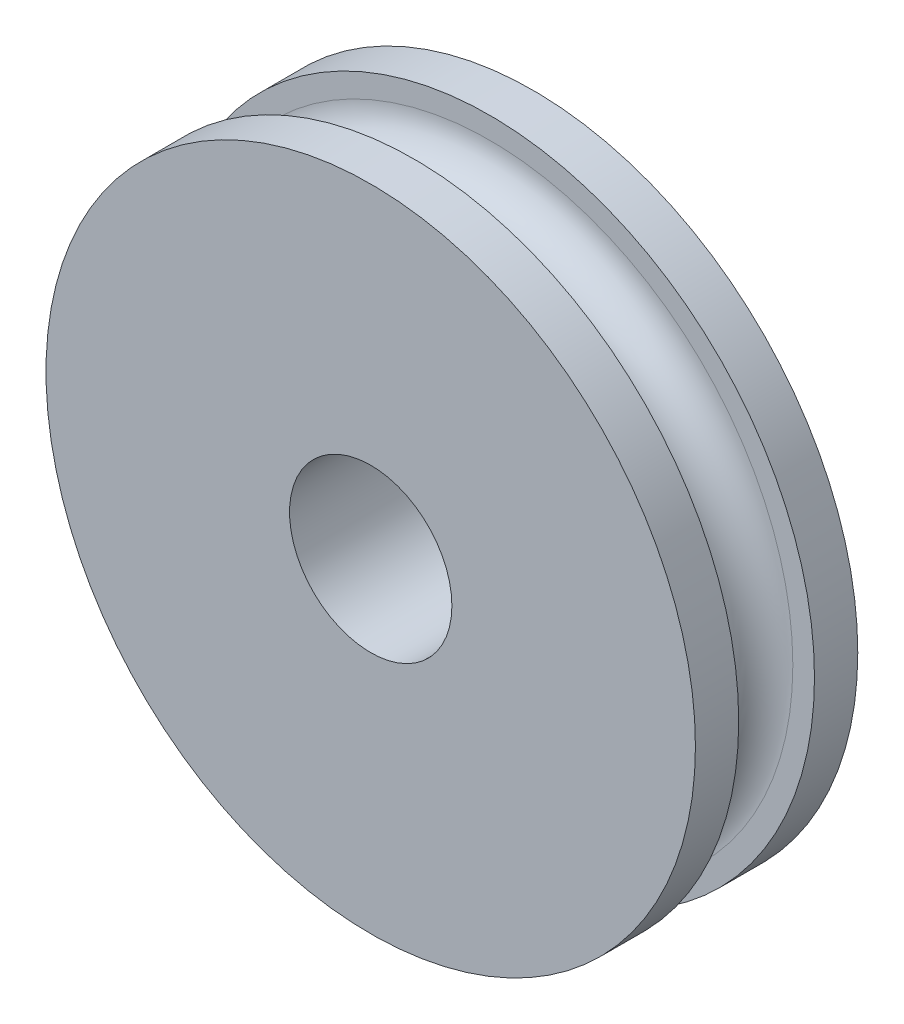
ISO-10303-21;
HEADER;
FILE_DESCRIPTION(('STEP AP214'),'2;1');
FILE_NAME('part.step','',(''),(''),'','','');
FILE_SCHEMA(('AUTOMOTIVE_DESIGN { 1 0 10303 214 1 1 1 1 }'));
ENDSEC;
DATA;
#1=APPLICATION_CONTEXT('core data for automotive mechanical design processes');
#2=APPLICATION_PROTOCOL_DEFINITION('international standard','automotive_design',2000,#1);
#3=PRODUCT_CONTEXT('',#1,'mechanical');
#4=PRODUCT('Part','Part','',(#3));
#5=PRODUCT_RELATED_PRODUCT_CATEGORY('part','',(#4));
#6=PRODUCT_DEFINITION_FORMATION('','',#4);
#7=PRODUCT_DEFINITION_CONTEXT('part definition',#1,'design');
#8=PRODUCT_DEFINITION('design','',#6,#7);
#9=PRODUCT_DEFINITION_SHAPE('','',#8);
#10=(LENGTH_UNIT() NAMED_UNIT(*) SI_UNIT(.MILLI.,.METRE.));
#11=(NAMED_UNIT(*) PLANE_ANGLE_UNIT() SI_UNIT($,.RADIAN.));
#12=(NAMED_UNIT(*) SI_UNIT($,.STERADIAN.) SOLID_ANGLE_UNIT());
#13=UNCERTAINTY_MEASURE_WITH_UNIT(LENGTH_MEASURE(1.E-05),#10,'distance_accuracy_value','');
#14=(GEOMETRIC_REPRESENTATION_CONTEXT(3) GLOBAL_UNCERTAINTY_ASSIGNED_CONTEXT((#13)) GLOBAL_UNIT_ASSIGNED_CONTEXT((#10,
#11,#12)) REPRESENTATION_CONTEXT('',''));
#15=CARTESIAN_POINT('',(0.,0.,0.));
#16=DIRECTION('',(0.,0.,1.));
#17=DIRECTION('',(1.,0.,0.));
#18=AXIS2_PLACEMENT_3D('',#15,#16,#17);
#19=CARTESIAN_POINT('',(0.,0.,-0.7));
#20=DIRECTION('',(0.,0.,1.));
#21=DIRECTION('',(1.,0.,0.));
#22=AXIS2_PLACEMENT_3D('',#19,#20,#21);
#23=PLANE('',#22);
#24=CARTESIAN_POINT('',(0.,0.,-0.7));
#25=DIRECTION('',(0.,0.,1.));
#26=DIRECTION('',(1.,0.,0.));
#27=AXIS2_PLACEMENT_3D('',#24,#25,#26);
#28=CIRCLE('',#27,6.);
#29=CARTESIAN_POINT('',(6.,0.,-0.7));
#30=VERTEX_POINT('',#29);
#31=EDGE_CURVE('E80',#30,#30,#28,.T.);
#32=ORIENTED_EDGE('',*,*,#31,.T.);
#33=EDGE_LOOP('',(#32));
#34=FACE_BOUND('',#33,.T.);
#35=CARTESIAN_POINT('',(0.,0.,-0.7));
#36=DIRECTION('',(0.,0.,1.));
#37=DIRECTION('',(1.,0.,0.));
#38=AXIS2_PLACEMENT_3D('',#35,#36,#37);
#39=CIRCLE('',#38,5.6);
#40=CARTESIAN_POINT('',(5.6,0.,-0.7));
#41=VERTEX_POINT('',#40);
#42=EDGE_CURVE('E10',#41,#41,#39,.T.);
#43=ORIENTED_EDGE('',*,*,#42,.F.);
#44=EDGE_LOOP('',(#43));
#45=FACE_BOUND('',#44,.T.);
#46=ADVANCED_FACE('F45',(#34,#45),#23,.T.);
#47=CARTESIAN_POINT('',(0.,0.,0.));
#48=DIRECTION('',(0.,0.,1.));
#49=DIRECTION('',(1.,0.,0.));
#50=AXIS2_PLACEMENT_3D('',#47,#48,#49);
#51=TOROIDAL_SURFACE('',#50,5.6,0.7);
#52=CARTESIAN_POINT('',(0.,0.,0.7));
#53=DIRECTION('',(0.,0.,1.));
#54=DIRECTION('',(1.,0.,0.));
#55=AXIS2_PLACEMENT_3D('',#52,#53,#54);
#56=CIRCLE('',#55,5.6);
#57=CARTESIAN_POINT('',(5.6,0.,0.7));
#58=VERTEX_POINT('',#57);
#59=EDGE_CURVE('E52',#58,#58,#56,.T.);
#60=ORIENTED_EDGE('',*,*,#59,.F.);
#61=EDGE_LOOP('',(#60));
#62=FACE_BOUND('',#61,.T.);
#63=ORIENTED_EDGE('',*,*,#42,.T.);
#64=EDGE_LOOP('',(#63));
#65=FACE_BOUND('',#64,.T.);
#66=ADVANCED_FACE('F99',(#62,#65),#51,.F.);
#67=CARTESIAN_POINT('',(0.,0.,0.7));
#68=DIRECTION('',(0.,0.,1.));
#69=DIRECTION('',(1.,0.,0.));
#70=AXIS2_PLACEMENT_3D('',#67,#68,#69);
#71=PLANE('',#70);
#72=CARTESIAN_POINT('',(0.,0.,0.7));
#73=DIRECTION('',(0.,0.,1.));
#74=DIRECTION('',(1.,0.,0.));
#75=AXIS2_PLACEMENT_3D('',#72,#73,#74);
#76=CIRCLE('',#75,6.);
#77=CARTESIAN_POINT('',(6.,0.,0.7));
#78=VERTEX_POINT('',#77);
#79=EDGE_CURVE('E57',#78,#78,#76,.T.);
#80=ORIENTED_EDGE('',*,*,#79,.F.);
#81=EDGE_LOOP('',(#80));
#82=FACE_BOUND('',#81,.T.);
#83=ORIENTED_EDGE('',*,*,#59,.T.);
#84=EDGE_LOOP('',(#83));
#85=FACE_BOUND('',#84,.T.);
#86=ADVANCED_FACE('F103',(#82,#85),#71,.F.);
#87=CARTESIAN_POINT('',(0.,0.,1.5));
#88=DIRECTION('',(0.,0.,1.));
#89=DIRECTION('',(1.,0.,0.));
#90=AXIS2_PLACEMENT_3D('',#87,#88,#89);
#91=CYLINDRICAL_SURFACE('',#90,6.);
#92=CARTESIAN_POINT('',(0.,0.,1.5));
#93=DIRECTION('',(0.,0.,1.));
#94=DIRECTION('',(1.,0.,0.));
#95=AXIS2_PLACEMENT_3D('',#92,#93,#94);
#96=CIRCLE('',#95,6.);
#97=CARTESIAN_POINT('',(6.,0.,1.5));
#98=VERTEX_POINT('',#97);
#99=EDGE_CURVE('E62',#98,#98,#96,.T.);
#100=ORIENTED_EDGE('',*,*,#99,.F.);
#101=EDGE_LOOP('',(#100));
#102=FACE_BOUND('',#101,.T.);
#103=ORIENTED_EDGE('',*,*,#79,.T.);
#104=EDGE_LOOP('',(#103));
#105=FACE_BOUND('',#104,.T.);
#106=ADVANCED_FACE('F108',(#102,#105),#91,.T.);
#107=CARTESIAN_POINT('',(0.,0.,1.5));
#108=DIRECTION('',(0.,0.,1.));
#109=DIRECTION('',(1.,0.,0.));
#110=AXIS2_PLACEMENT_3D('',#107,#108,#109);
#111=PLANE('',#110);
#112=ORIENTED_EDGE('',*,*,#99,.T.);
#113=EDGE_LOOP('',(#112));
#114=FACE_BOUND('',#113,.T.);
#115=CARTESIAN_POINT('',(0.,0.,1.5));
#116=DIRECTION('',(0.,0.,1.));
#117=DIRECTION('',(1.,0.,0.));
#118=AXIS2_PLACEMENT_3D('',#115,#116,#117);
#119=CIRCLE('',#118,1.5);
#120=CARTESIAN_POINT('',(1.5,0.,1.5));
#121=VERTEX_POINT('',#120);
#122=EDGE_CURVE('E68',#121,#121,#119,.T.);
#123=ORIENTED_EDGE('',*,*,#122,.F.);
#124=EDGE_LOOP('',(#123));
#125=FACE_BOUND('',#124,.T.);
#126=ADVANCED_FACE('F114',(#114,#125),#111,.T.);
#127=CARTESIAN_POINT('',(0.,0.,1.5));
#128=DIRECTION('',(0.,0.,1.));
#129=DIRECTION('',(1.,0.,0.));
#130=AXIS2_PLACEMENT_3D('',#127,#128,#129);
#131=CYLINDRICAL_SURFACE('',#130,1.5);
#132=ORIENTED_EDGE('',*,*,#122,.T.);
#133=EDGE_LOOP('',(#132));
#134=FACE_BOUND('',#133,.T.);
#135=CARTESIAN_POINT('',(0.,0.,-1.5));
#136=DIRECTION('',(0.,0.,1.));
#137=DIRECTION('',(1.,0.,0.));
#138=AXIS2_PLACEMENT_3D('',#135,#136,#137);
#139=CIRCLE('',#138,1.5);
#140=CARTESIAN_POINT('',(1.5,0.,-1.5));
#141=VERTEX_POINT('',#140);
#142=EDGE_CURVE('E72',#141,#141,#139,.T.);
#143=ORIENTED_EDGE('',*,*,#142,.F.);
#144=EDGE_LOOP('',(#143));
#145=FACE_BOUND('',#144,.T.);
#146=ADVANCED_FACE('F95',(#134,#145),#131,.F.);
#147=CARTESIAN_POINT('',(0.,0.,-1.5));
#148=DIRECTION('',(0.,0.,1.));
#149=DIRECTION('',(1.,0.,0.));
#150=AXIS2_PLACEMENT_3D('',#147,#148,#149);
#151=PLANE('',#150);
#152=CARTESIAN_POINT('',(0.,0.,-1.5));
#153=DIRECTION('',(0.,0.,1.));
#154=DIRECTION('',(1.,0.,0.));
#155=AXIS2_PLACEMENT_3D('',#152,#153,#154);
#156=CIRCLE('',#155,6.);
#157=CARTESIAN_POINT('',(6.,0.,-1.5));
#158=VERTEX_POINT('',#157);
#159=EDGE_CURVE('E76',#158,#158,#156,.T.);
#160=ORIENTED_EDGE('',*,*,#159,.F.);
#161=EDGE_LOOP('',(#160));
#162=FACE_BOUND('',#161,.T.);
#163=ORIENTED_EDGE('',*,*,#142,.T.);
#164=EDGE_LOOP('',(#163));
#165=FACE_BOUND('',#164,.T.);
#166=ADVANCED_FACE('F89',(#162,#165),#151,.F.);
#167=CARTESIAN_POINT('',(0.,0.,1.5));
#168=DIRECTION('',(0.,0.,1.));
#169=DIRECTION('',(1.,0.,0.));
#170=AXIS2_PLACEMENT_3D('',#167,#168,#169);
#171=CYLINDRICAL_SURFACE('',#170,6.);
#172=ORIENTED_EDGE('',*,*,#159,.T.);
#173=EDGE_LOOP('',(#172));
#174=FACE_BOUND('',#173,.T.);
#175=ORIENTED_EDGE('',*,*,#31,.F.);
#176=EDGE_LOOP('',(#175));
#177=FACE_BOUND('',#176,.T.);
#178=ADVANCED_FACE('F87',(#174,#177),#171,.T.);
#179=CLOSED_SHELL('',(#46,#66,#86,#106,#126,#146,#166,#178));
#180=MANIFOLD_SOLID_BREP('B2',#179);
#181=ADVANCED_BREP_SHAPE_REPRESENTATION('',(#18,#180),#14);
#182=SHAPE_DEFINITION_REPRESENTATION(#9,#181);
ENDSEC;
END-ISO-10303-21;
